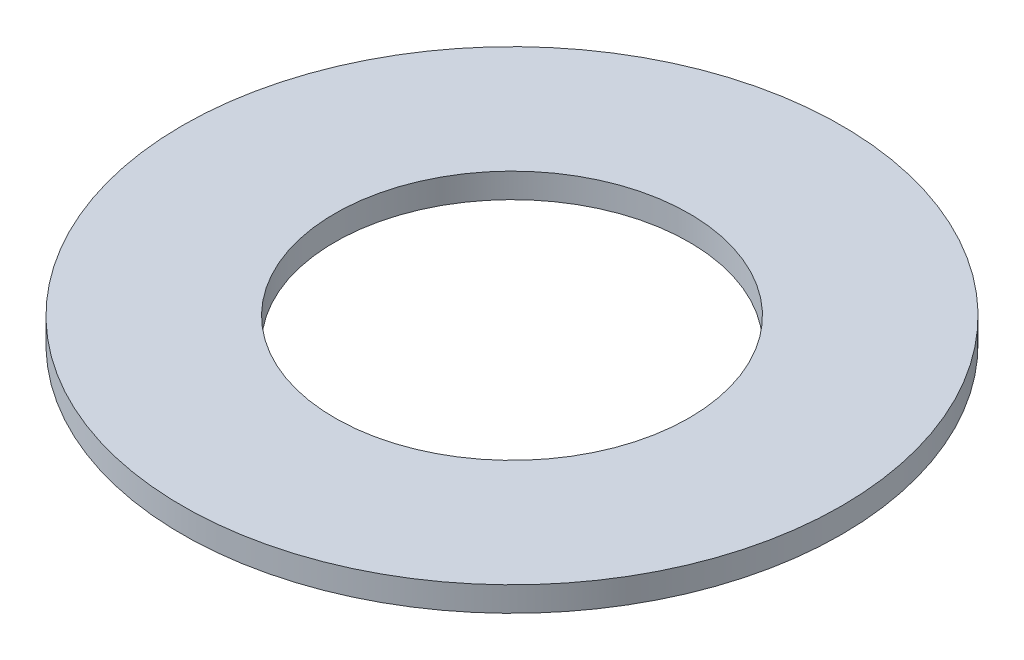
ISO-10303-21;
HEADER;
FILE_DESCRIPTION(('STEP AP214'),'2;1');
FILE_NAME('part.step','',(''),(''),'','','');
FILE_SCHEMA(('AUTOMOTIVE_DESIGN { 1 0 10303 214 1 1 1 1 }'));
ENDSEC;
DATA;
#1=APPLICATION_CONTEXT('core data for automotive mechanical design processes');
#2=APPLICATION_PROTOCOL_DEFINITION('international standard','automotive_design',2000,#1);
#3=PRODUCT_CONTEXT('',#1,'mechanical');
#4=PRODUCT('Part','Part','',(#3));
#5=PRODUCT_RELATED_PRODUCT_CATEGORY('part','',(#4));
#6=PRODUCT_DEFINITION_FORMATION('','',#4);
#7=PRODUCT_DEFINITION_CONTEXT('part definition',#1,'design');
#8=PRODUCT_DEFINITION('design','',#6,#7);
#9=PRODUCT_DEFINITION_SHAPE('','',#8);
#10=(LENGTH_UNIT() NAMED_UNIT(*) SI_UNIT(.MILLI.,.METRE.));
#11=(NAMED_UNIT(*) PLANE_ANGLE_UNIT() SI_UNIT($,.RADIAN.));
#12=(NAMED_UNIT(*) SI_UNIT($,.STERADIAN.) SOLID_ANGLE_UNIT());
#13=UNCERTAINTY_MEASURE_WITH_UNIT(LENGTH_MEASURE(1.E-05),#10,'distance_accuracy_value','');
#14=(GEOMETRIC_REPRESENTATION_CONTEXT(3) GLOBAL_UNCERTAINTY_ASSIGNED_CONTEXT((#13)) GLOBAL_UNIT_ASSIGNED_CONTEXT((#10,
#11,#12)) REPRESENTATION_CONTEXT('',''));
#15=CARTESIAN_POINT('',(0.,0.,0.));
#16=DIRECTION('',(0.,0.,1.));
#17=DIRECTION('',(1.,0.,0.));
#18=AXIS2_PLACEMENT_3D('',#15,#16,#17);
#19=CARTESIAN_POINT('',(0.,0.,0.));
#20=DIRECTION('',(0.,-1.,0.));
#21=DIRECTION('',(1.,0.,0.));
#22=AXIS2_PLACEMENT_3D('',#19,#20,#21);
#23=CYLINDRICAL_SURFACE('',#22,2.15);
#24=CARTESIAN_POINT('',(0.,0.,0.));
#25=DIRECTION('',(0.,-1.,0.));
#26=DIRECTION('',(1.,0.,0.));
#27=AXIS2_PLACEMENT_3D('',#24,#25,#26);
#28=CIRCLE('',#27,2.15);
#29=CARTESIAN_POINT('',(2.15,0.,0.));
#30=VERTEX_POINT('',#29);
#31=EDGE_CURVE('E51',#30,#30,#28,.T.);
#32=ORIENTED_EDGE('',*,*,#31,.T.);
#33=EDGE_LOOP('',(#32));
#34=FACE_BOUND('',#33,.T.);
#35=CARTESIAN_POINT('',(0.,0.3,0.));
#36=DIRECTION('',(0.,-1.,0.));
#37=DIRECTION('',(1.,0.,0.));
#38=AXIS2_PLACEMENT_3D('',#35,#36,#37);
#39=CIRCLE('',#38,2.15);
#40=CARTESIAN_POINT('',(2.15,0.3,0.));
#41=VERTEX_POINT('',#40);
#42=EDGE_CURVE('E10',#41,#41,#39,.T.);
#43=ORIENTED_EDGE('',*,*,#42,.F.);
#44=EDGE_LOOP('',(#43));
#45=FACE_BOUND('',#44,.T.);
#46=ADVANCED_FACE('F37',(#34,#45),#23,.F.);
#47=CARTESIAN_POINT('',(2.15,0.3,0.));
#48=DIRECTION('',(0.,1.,0.));
#49=DIRECTION('',(-1.,0.,0.));
#50=AXIS2_PLACEMENT_3D('',#47,#48,#49);
#51=PLANE('',#50);
#52=ORIENTED_EDGE('',*,*,#42,.T.);
#53=EDGE_LOOP('',(#52));
#54=FACE_BOUND('',#53,.T.);
#55=CARTESIAN_POINT('',(0.,0.3,0.));
#56=DIRECTION('',(0.,-1.,0.));
#57=DIRECTION('',(1.,0.,0.));
#58=AXIS2_PLACEMENT_3D('',#55,#56,#57);
#59=CIRCLE('',#58,4.);
#60=CARTESIAN_POINT('',(4.,0.3,0.));
#61=VERTEX_POINT('',#60);
#62=EDGE_CURVE('E43',#61,#61,#59,.T.);
#63=ORIENTED_EDGE('',*,*,#62,.F.);
#64=EDGE_LOOP('',(#63));
#65=FACE_BOUND('',#64,.T.);
#66=ADVANCED_FACE('F67',(#54,#65),#51,.T.);
#67=CARTESIAN_POINT('',(0.,0.,0.));
#68=DIRECTION('',(0.,-1.,0.));
#69=DIRECTION('',(1.,0.,0.));
#70=AXIS2_PLACEMENT_3D('',#67,#68,#69);
#71=CYLINDRICAL_SURFACE('',#70,4.);
#72=ORIENTED_EDGE('',*,*,#62,.T.);
#73=EDGE_LOOP('',(#72));
#74=FACE_BOUND('',#73,.T.);
#75=CARTESIAN_POINT('',(0.,0.,0.));
#76=DIRECTION('',(0.,-1.,0.));
#77=DIRECTION('',(1.,0.,0.));
#78=AXIS2_PLACEMENT_3D('',#75,#76,#77);
#79=CIRCLE('',#78,4.);
#80=CARTESIAN_POINT('',(4.,0.,0.));
#81=VERTEX_POINT('',#80);
#82=EDGE_CURVE('E47',#81,#81,#79,.T.);
#83=ORIENTED_EDGE('',*,*,#82,.F.);
#84=EDGE_LOOP('',(#83));
#85=FACE_BOUND('',#84,.T.);
#86=ADVANCED_FACE('F61',(#74,#85),#71,.T.);
#87=CARTESIAN_POINT('',(2.15,0.,0.));
#88=DIRECTION('',(0.,-1.,0.));
#89=DIRECTION('',(1.,0.,0.));
#90=AXIS2_PLACEMENT_3D('',#87,#88,#89);
#91=PLANE('',#90);
#92=ORIENTED_EDGE('',*,*,#82,.T.);
#93=EDGE_LOOP('',(#92));
#94=FACE_BOUND('',#93,.T.);
#95=ORIENTED_EDGE('',*,*,#31,.F.);
#96=EDGE_LOOP('',(#95));
#97=FACE_BOUND('',#96,.T.);
#98=ADVANCED_FACE('F59',(#94,#97),#91,.T.);
#99=CLOSED_SHELL('',(#46,#66,#86,#98));
#100=MANIFOLD_SOLID_BREP('B2',#99);
#101=ADVANCED_BREP_SHAPE_REPRESENTATION('',(#18,#100),#14);
#102=SHAPE_DEFINITION_REPRESENTATION(#9,#101);
ENDSEC;
END-ISO-10303-21;
